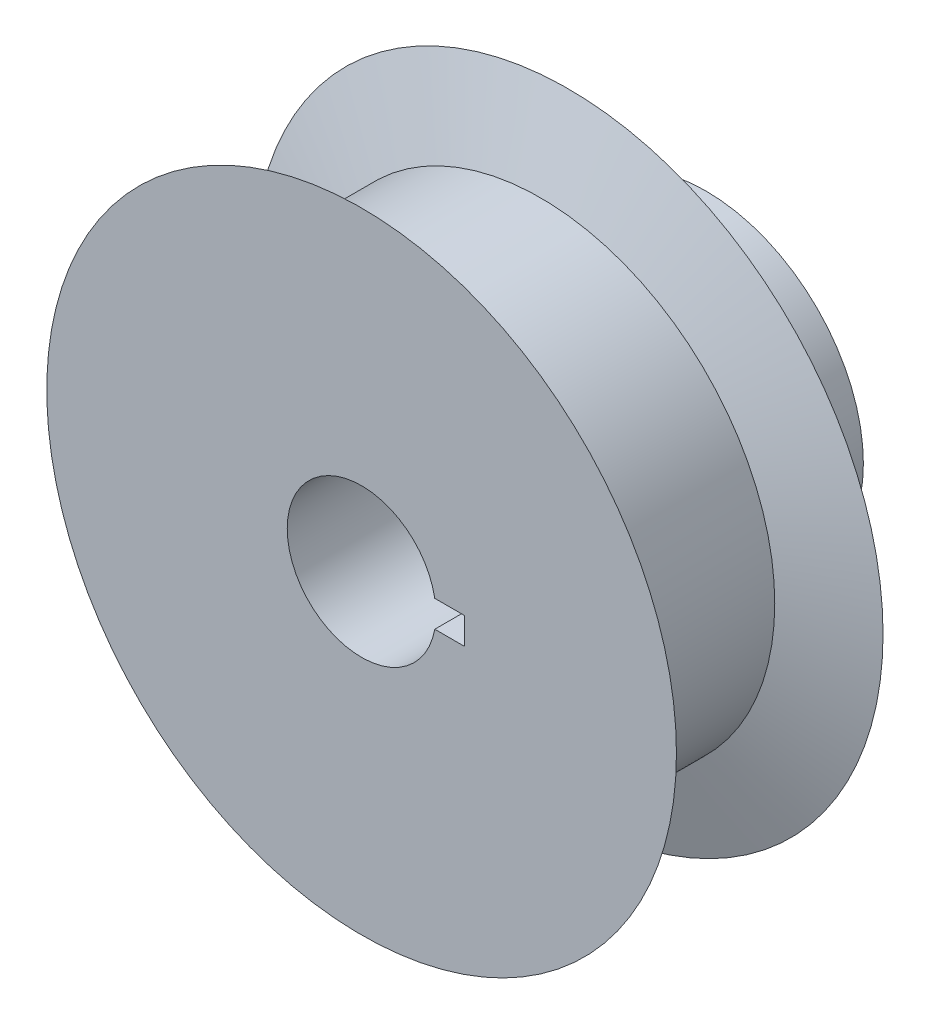
ISO-10303-21;
HEADER;
FILE_DESCRIPTION(('STEP AP214'),'2;1');
FILE_NAME('part.step','',(''),(''),'','','');
FILE_SCHEMA(('AUTOMOTIVE_DESIGN { 1 0 10303 214 1 1 1 1 }'));
ENDSEC;
DATA;
#1=APPLICATION_CONTEXT('core data for automotive mechanical design processes');
#2=APPLICATION_PROTOCOL_DEFINITION('international standard','automotive_design',2000,#1);
#3=PRODUCT_CONTEXT('',#1,'mechanical');
#4=PRODUCT('Part','Part','',(#3));
#5=PRODUCT_RELATED_PRODUCT_CATEGORY('part','',(#4));
#6=PRODUCT_DEFINITION_FORMATION('','',#4);
#7=PRODUCT_DEFINITION_CONTEXT('part definition',#1,'design');
#8=PRODUCT_DEFINITION('design','',#6,#7);
#9=PRODUCT_DEFINITION_SHAPE('','',#8);
#10=(LENGTH_UNIT() NAMED_UNIT(*) SI_UNIT(.MILLI.,.METRE.));
#11=(NAMED_UNIT(*) PLANE_ANGLE_UNIT() SI_UNIT($,.RADIAN.));
#12=(NAMED_UNIT(*) SI_UNIT($,.STERADIAN.) SOLID_ANGLE_UNIT());
#13=UNCERTAINTY_MEASURE_WITH_UNIT(LENGTH_MEASURE(1.E-05),#10,'distance_accuracy_value','');
#14=(GEOMETRIC_REPRESENTATION_CONTEXT(3) GLOBAL_UNCERTAINTY_ASSIGNED_CONTEXT((#13)) GLOBAL_UNIT_ASSIGNED_CONTEXT((#10,
#11,#12)) REPRESENTATION_CONTEXT('',''));
#15=CARTESIAN_POINT('',(0.,0.,0.));
#16=DIRECTION('',(0.,0.,1.));
#17=DIRECTION('',(1.,0.,0.));
#18=AXIS2_PLACEMENT_3D('',#15,#16,#17);
#19=CARTESIAN_POINT('',(0.,0.,-11.1125));
#20=DIRECTION('',(0.,0.,1.));
#21=DIRECTION('',(1.,0.,0.));
#22=AXIS2_PLACEMENT_3D('',#19,#20,#21);
#23=CYLINDRICAL_SURFACE('',#22,12.7);
#24=CARTESIAN_POINT('',(0.,0.,-11.1125));
#25=DIRECTION('',(0.,0.,-1.));
#26=DIRECTION('',(-1.,0.,0.));
#27=AXIS2_PLACEMENT_3D('',#24,#25,#26);
#28=CIRCLE('',#27,12.7);
#29=CARTESIAN_POINT('',(-12.7,0.,-11.1125));
#30=VERTEX_POINT('',#29);
#31=EDGE_CURVE('E46',#30,#30,#28,.T.);
#32=ORIENTED_EDGE('',*,*,#31,.F.);
#33=EDGE_LOOP('',(#32));
#34=FACE_BOUND('',#33,.T.);
#35=CARTESIAN_POINT('',(0.,0.,0.));
#36=DIRECTION('',(0.,0.,1.));
#37=DIRECTION('',(1.,0.,0.));
#38=AXIS2_PLACEMENT_3D('',#35,#36,#37);
#39=CIRCLE('',#38,12.7);
#40=CARTESIAN_POINT('',(12.7,0.,0.));
#41=VERTEX_POINT('',#40);
#42=EDGE_CURVE('E11',#41,#41,#39,.F.);
#43=ORIENTED_EDGE('',*,*,#42,.T.);
#44=EDGE_LOOP('',(#43));
#45=FACE_BOUND('',#44,.T.);
#46=CARTESIAN_POINT('',(0.599890423792715,-12.6858240362793,-8.82142));
#47=CARTESIAN_POINT('',(0.781499915618334,-12.6772325661334,-8.821414559961));
#48=CARTESIAN_POINT('',(0.962983905724362,-12.6647058853353,-8.80621038397143));
#49=CARTESIAN_POINT('',(1.3203597935846,-12.6324548574158,-8.74607005273274));
#50=CARTESIAN_POINT('',(1.49624791259333,-12.6127257543198,-8.70111423560601));
#51=CARTESIAN_POINT('',(1.8372428366672,-12.5675808253428,-8.58316031772912));
#52=CARTESIAN_POINT('',(2.00236601536051,-12.5421739091111,-8.51020602502936));
#53=CARTESIAN_POINT('',(2.31790452288061,-12.4877134753631,-8.33848176077857));
#54=CARTESIAN_POINT('',(2.46831926664194,-12.458659812893,-8.23971076287584));
#55=CARTESIAN_POINT('',(2.75418593482141,-12.3986419822888,-8.01632914503875));
#56=CARTESIAN_POINT('',(2.8891910790202,-12.3676486729577,-7.89115428364959));
#57=CARTESIAN_POINT('',(3.13646201368765,-12.3072678379319,-7.61969393720618));
#58=CARTESIAN_POINT('',(3.24872509430695,-12.2778805039027,-7.47340593995097));
#59=CARTESIAN_POINT('',(3.44845955901979,-12.2232974233163,-7.16168067319548));
#60=CARTESIAN_POINT('',(3.53564228636154,-12.1981517597457,-6.99604908252736));
#61=CARTESIAN_POINT('',(3.68065673550874,-12.1551853518605,-6.6515157272737));
#62=CARTESIAN_POINT('',(3.73849668607564,-12.1373625542197,-6.47261769921876));
#63=CARTESIAN_POINT('',(3.82124837634827,-12.1115602196657,-6.11315997859999));
#64=CARTESIAN_POINT('',(3.84722108108681,-12.1032641536063,-5.93286754868075));
#65=CARTESIAN_POINT('',(3.86881048150892,-12.0963816478951,-5.57030833808095));
#66=CARTESIAN_POINT('',(3.86443408628312,-12.0977929983115,-5.38804201619754));
#67=CARTESIAN_POINT('',(3.82618912587903,-12.1099395911969,-5.03332956055399));
#68=CARTESIAN_POINT('',(3.79333820049087,-12.12035307611,-4.86076111093762));
#69=CARTESIAN_POINT('',(3.70067128518278,-12.1489654534983,-4.52371288539244));
#70=CARTESIAN_POINT('',(3.64085282304655,-12.167165059749,-4.35923385258471));
#71=CARTESIAN_POINT('',(3.49505079595303,-12.2098503421476,-4.04017981961719));
#72=CARTESIAN_POINT('',(3.40868688849079,-12.2344265265299,-3.88579119514233));
#73=CARTESIAN_POINT('',(3.2125853539112,-12.2873750770946,-3.59337148245946));
#74=CARTESIAN_POINT('',(3.10284223127395,-12.3157483352333,-3.45534425205527));
#75=CARTESIAN_POINT('',(2.85762242470447,-12.3749966100948,-3.19336412870629));
#76=CARTESIAN_POINT('',(2.72124717222365,-12.4059267184544,-3.07026361921543));
#77=CARTESIAN_POINT('',(2.42958851879229,-12.4663247212654,-2.84849516580125));
#78=CARTESIAN_POINT('',(2.27430308200096,-12.4957924577985,-2.74982985600819));
#79=CARTESIAN_POINT('',(1.94656942883071,-12.5510484449517,-2.57857175372722));
#80=CARTESIAN_POINT('',(1.77391712430892,-12.5767814132278,-2.5063504550767));
#81=CARTESIAN_POINT('',(1.4180572792777,-12.6218554433664,-2.39231297306028));
#82=CARTESIAN_POINT('',(1.23485191917157,-12.6411978200877,-2.35049053302718));
#83=CARTESIAN_POINT('',(0.868526667234643,-12.6715623132124,-2.29958919221786));
#84=CARTESIAN_POINT('',(0.68554752746456,-12.682801885129,-2.28962772019902));
#85=CARTESIAN_POINT('',(0.320199212268037,-12.6972783649422,-2.30049667813913));
#86=CARTESIAN_POINT('',(0.137829946292931,-12.7005165187703,-2.32132231331176));
#87=CARTESIAN_POINT('',(-0.216241931832223,-12.6993628203996,-2.39227903048679));
#88=CARTESIAN_POINT('',(-0.388097807147044,-12.6951626148262,-2.44165258832991));
#89=CARTESIAN_POINT('',(-0.721230675093228,-12.680601222491,-2.56763709386153));
#90=CARTESIAN_POINT('',(-0.88250708949256,-12.6702396992865,-2.64424952885395));
#91=CARTESIAN_POINT('',(-1.19158784802362,-12.6449362385456,-2.82332086694122));
#92=CARTESIAN_POINT('',(-1.33925487159851,-12.6299531110891,-2.92601066728536));
#93=CARTESIAN_POINT('',(-1.61561953097636,-12.5975857558523,-3.15405042557506));
#94=CARTESIAN_POINT('',(-1.74431425345544,-12.5802011601027,-3.27940385710684));
#95=CARTESIAN_POINT('',(-1.98227728340032,-12.5449361578294,-3.55275786773037));
#96=CARTESIAN_POINT('',(-2.09100245751892,-12.5270539022117,-3.70123157231208));
#97=CARTESIAN_POINT('',(-2.28209788904067,-12.4936573862321,-4.01451908490168));
#98=CARTESIAN_POINT('',(-2.36446808375056,-12.4781431315033,-4.17933293177829));
#99=CARTESIAN_POINT('',(-2.5005401988816,-12.4515920159796,-4.5210630557227));
#100=CARTESIAN_POINT('',(-2.55419666590558,-12.44056226067,-4.69799802392935));
#101=CARTESIAN_POINT('',(-2.63091956330617,-12.4245653215815,-5.05863770560876));
#102=CARTESIAN_POINT('',(-2.65399070207697,-12.4195972046658,-5.24234137261218));
#103=CARTESIAN_POINT('',(-2.66863407895253,-12.4164585536595,-5.60734752730222));
#104=CARTESIAN_POINT('',(-2.66083003353647,-12.4181534148444,-5.78862407531853));
#105=CARTESIAN_POINT('',(-2.61537996794529,-12.4278041662189,-6.14721758332917));
#106=CARTESIAN_POINT('',(-2.57773428847538,-12.4357599849264,-6.32453458850627));
#107=CARTESIAN_POINT('',(-2.4740355686948,-12.4568015874471,-6.66941127904578));
#108=CARTESIAN_POINT('',(-2.40811526694805,-12.469863375599,-6.83701245406624));
#109=CARTESIAN_POINT('',(-2.24981673089795,-12.4993911092568,-7.15889079544913));
#110=CARTESIAN_POINT('',(-2.15743548417623,-12.51585744229,-7.31316644217663));
#111=CARTESIAN_POINT('',(-1.94671638176032,-12.5503736332648,-7.60719645417165));
#112=CARTESIAN_POINT('',(-1.82791525104076,-12.5684477807142,-7.74661608377171));
#113=CARTESIAN_POINT('',(-1.5685901361698,-12.6034363589931,-8.00375839048472));
#114=CARTESIAN_POINT('',(-1.42806234162893,-12.6203505856449,-8.12147725379554));
#115=CARTESIAN_POINT('',(-1.12770258578257,-12.6507409407537,-8.33285590361497));
#116=CARTESIAN_POINT('',(-0.967710129606117,-12.6641851706352,-8.42629252153702));
#117=CARTESIAN_POINT('',(-0.633983761456787,-12.6852640708827,-8.58484043855997));
#118=CARTESIAN_POINT('',(-0.460260198291297,-12.6929030712774,-8.64997283377505));
#119=CARTESIAN_POINT('',(-0.138894272977151,-12.7000523707523,-8.74019925556416));
#120=CARTESIAN_POINT('',(0.00724884055228734,-12.7008547214661,-8.77061678293768));
#121=CARTESIAN_POINT('',(0.302252935425036,-12.6972595520596,-8.81122892118289));
#122=CARTESIAN_POINT('',(0.451113792207188,-12.6928622696658,-8.82142445654393));
#123=CARTESIAN_POINT('',(0.599890423792715,-12.6858240362793,-8.82142));
#124=B_SPLINE_CURVE_WITH_KNOTS('',3,(#46,#47,#48,#49,#50,#51,#52,#53,#54,#55,#56,#57,#58,#59,
#60,#61,#62,#63,#64,#65,#66,#67,#68,#69,#70,#71,#72,#73,#74,#75,#76,#77,#78,#79,#80,#81,#82,#83,
#84,#85,#86,#87,#88,#89,#90,#91,#92,#93,#94,#95,#96,#97,#98,#99,#100,#101,#102,#103,#104,#105,
#106,#107,#108,#109,#110,#111,#112,#113,#114,#115,#116,#117,#118,#119,#120,#121,#122,#123),
.UNSPECIFIED.,.T.,.F.,(4,2,2,2,2,2,2,2,2,2,2,2,2,2,2,2,2,2,2,2,2,2,2,2,2,2,2,2,2,2,2,2,2,2,2,2,
2,2,4),(0.,0.544884526702368,1.09012950967437,1.63452482590377,2.17894178804279,
2.73645011780765,3.29402483891422,3.85778122046588,4.42137941709938,4.96565445608014,
5.50980559279984,6.03527573241726,6.56079405367239,7.09422372792981,7.62777892882716,
8.18411168750397,8.74050439313071,9.30443807858892,9.86825566280428,10.4163134122698,
10.9642858161729,11.4983445948033,12.0324325387228,12.5714252234892,13.1105005881733,
13.6625720767992,14.2146448786836,14.7675890375512,15.3204480647019,15.8621962611779,
16.4039382725444,16.9431643796467,17.4824518987919,18.0320688005284,18.5817822028163,
19.13638213317,19.6905679891061,20.136964210064,20.5833400226438),.UNSPECIFIED.);
#125=CARTESIAN_POINT('',(0.599890423792715,-12.6858240362793,-8.82142));
#126=VERTEX_POINT('',#125);
#127=EDGE_CURVE('E103',#126,#126,#124,.T.);
#128=ORIENTED_EDGE('',*,*,#127,.F.);
#129=EDGE_LOOP('',(#128));
#130=FACE_BOUND('',#129,.T.);
#131=ADVANCED_FACE('F33',(#34,#45,#130),#23,.T.);
#132=CARTESIAN_POINT('',(0.,0.,16.66748));
#133=DIRECTION('',(0.,0.,-1.));
#134=DIRECTION('',(-1.,0.,0.));
#135=AXIS2_PLACEMENT_3D('',#132,#133,#134);
#136=CYLINDRICAL_SURFACE('',#135,6.);
#137=CARTESIAN_POINT('',(0.,0.,-11.1125));
#138=DIRECTION('',(0.,0.,-1.));
#139=DIRECTION('',(-1.,0.,0.));
#140=AXIS2_PLACEMENT_3D('',#137,#138,#139);
#141=CIRCLE('',#140,6.);
#142=CARTESIAN_POINT('',(5.90226338505419,-1.07855780255333,-11.1125));
#143=VERTEX_POINT('',#142);
#144=CARTESIAN_POINT('',(5.90226338505419,1.07855780255334,-11.1125));
#145=VERTEX_POINT('',#144);
#146=EDGE_CURVE('E100',#143,#145,#141,.T.);
#147=ORIENTED_EDGE('',*,*,#146,.T.);
#148=DIRECTION('',(0.,0.,-1.));
#149=VECTOR('',#148,1.);
#150=CARTESIAN_POINT('',(5.90226338505419,1.07855780255334,16.66748));
#151=LINE('',#150,#149);
#152=CARTESIAN_POINT('',(5.90226338505419,1.07855780255334,16.66748));
#153=VERTEX_POINT('',#152);
#154=EDGE_CURVE('E118',#153,#145,#151,.T.);
#155=ORIENTED_EDGE('',*,*,#154,.F.);
#156=CARTESIAN_POINT('',(0.,0.,16.66748));
#157=DIRECTION('',(0.,0.,-1.));
#158=DIRECTION('',(-1.,0.,0.));
#159=AXIS2_PLACEMENT_3D('',#156,#157,#158);
#160=CIRCLE('',#159,6.);
#161=CARTESIAN_POINT('',(5.90226338505419,-1.07855780255334,16.66748));
#162=VERTEX_POINT('',#161);
#163=EDGE_CURVE('E53',#162,#153,#160,.T.);
#164=ORIENTED_EDGE('',*,*,#163,.F.);
#165=DIRECTION('',(0.,0.,-1.));
#166=VECTOR('',#165,1.);
#167=CARTESIAN_POINT('',(5.90226338505419,-1.07855780255333,16.66748));
#168=LINE('',#167,#166);
#169=EDGE_CURVE('E86',#162,#143,#168,.T.);
#170=ORIENTED_EDGE('',*,*,#169,.T.);
#171=EDGE_LOOP('',(#147,#155,#164,#170));
#172=FACE_BOUND('',#171,.T.);
#173=CARTESIAN_POINT('',(0.599890423792715,-5.96993563444714,-8.82142));
#174=CARTESIAN_POINT('',(0.517188567065031,-5.97824535937641,-8.8214193367522));
#175=CARTESIAN_POINT('',(0.434292466891896,-5.98483554052565,-8.8182721075559));
#176=CARTESIAN_POINT('',(0.268746068061959,-5.99455245827511,-8.8056402925649));
#177=CARTESIAN_POINT('',(0.186095930958278,-5.99767727475262,-8.79615219802353));
#178=CARTESIAN_POINT('',(0.0215623835931082,-6.00052584233722,-8.77085383742436));
#179=CARTESIAN_POINT('',(-0.0603195285123498,-6.00024394680347,-8.75503311697692));
#180=CARTESIAN_POINT('',(-0.222571835948983,-5.99642111021913,-8.71719619613604));
#181=CARTESIAN_POINT('',(-0.302941611205134,-5.99287886070412,-8.69517751080189));
#182=CARTESIAN_POINT('',(-0.540329290858641,-5.97771072316467,-8.62025396940035));
#183=CARTESIAN_POINT('',(-0.69433851158346,-5.9615522458911,-8.55837081703124));
#184=CARTESIAN_POINT('',(-0.990021720076639,-5.91964847555008,-8.41276882811694));
#185=CARTESIAN_POINT('',(-1.1316976129027,-5.89390466632671,-8.32905337189203));
#186=CARTESIAN_POINT('',(-1.40608553301741,-5.83467981578842,-8.13788736583231));
#187=CARTESIAN_POINT('',(-1.53810612535292,-5.80090243904,-8.02953739022671));
#188=CARTESIAN_POINT('',(-1.78333414714238,-5.7302741949364,-7.79408333655747));
#189=CARTESIAN_POINT('',(-1.89652924171249,-5.69342133601703,-7.66696706454681));
#190=CARTESIAN_POINT('',(-2.1113419649884,-5.61750555464239,-7.38415905181232));
#191=CARTESIAN_POINT('',(-2.21096550354705,-5.57854713846015,-7.22691905840363));
#192=CARTESIAN_POINT('',(-2.38255239518661,-5.50746176050839,-6.89641988188501));
#193=CARTESIAN_POINT('',(-2.45452159918646,-5.47533335433445,-6.72316409692291));
#194=CARTESIAN_POINT('',(-2.53914135272538,-5.4363296345809,-6.45644478177275));
#195=CARTESIAN_POINT('',(-2.56335147113455,-5.42491781662196,-6.36716934572491));
#196=CARTESIAN_POINT('',(-2.6041567949792,-5.40544959715944,-6.18655136800217));
#197=CARTESIAN_POINT('',(-2.62075562149105,-5.39739160024243,-6.09520983102541));
#198=CARTESIAN_POINT('',(-2.64611347912019,-5.38500562272272,-5.91123989044395));
#199=CARTESIAN_POINT('',(-2.6548766480278,-5.38067567348777,-5.81861219230098));
#200=CARTESIAN_POINT('',(-2.66446633521801,-5.37593114431687,-5.63287589576075));
#201=CARTESIAN_POINT('',(-2.66529355140702,-5.37551622008442,-5.53976734037178));
#202=CARTESIAN_POINT('',(-2.65642301044261,-5.37992046683034,-5.27899946243105));
#203=CARTESIAN_POINT('',(-2.63772378483922,-5.38921838573536,-5.11161776947799));
#204=CARTESIAN_POINT('',(-2.57516181366523,-5.41938114003802,-4.78281503429172));
#205=CARTESIAN_POINT('',(-2.53129267316566,-5.4402489149476,-4.6213955179685));
#206=CARTESIAN_POINT('',(-2.419729599324,-5.49077932125476,-4.30737028240446));
#207=CARTESIAN_POINT('',(-2.35188903178884,-5.52049590109273,-4.15482569569528));
#208=CARTESIAN_POINT('',(-2.19437906065333,-5.58497331089461,-3.86261935871359));
#209=CARTESIAN_POINT('',(-2.10470020956803,-5.61973632136487,-3.72296322028268));
#210=CARTESIAN_POINT('',(-1.89551213449476,-5.69390178086216,-3.44587475740554));
#211=CARTESIAN_POINT('',(-1.7739269546649,-5.73342250673631,-3.3100355525168));
#212=CARTESIAN_POINT('',(-1.50919852827073,-5.80872144774769,-3.05993082605811));
#213=CARTESIAN_POINT('',(-1.36604940360156,-5.84449863791631,-2.9456712060551));
#214=CARTESIAN_POINT('',(-1.05802401654371,-5.90811287016646,-2.7398322803931));
#215=CARTESIAN_POINT('',(-0.892753485432463,-5.93576671321788,-2.6487816234324));
#216=CARTESIAN_POINT('',(-0.547557714355909,-5.97748237576239,-2.49615896769573));
#217=CARTESIAN_POINT('',(-0.367645610383,-5.99155623617896,-2.43456087879416));
#218=CARTESIAN_POINT('',(-0.0160209937258541,-6.00232020953374,-2.34761586758588));
#219=CARTESIAN_POINT('',(0.154962609092308,-6.00046672768334,-2.3194953506414));
#220=CARTESIAN_POINT('',(0.49838284228537,-5.98173422815968,-2.29065562545005));
#221=CARTESIAN_POINT('',(0.670819018228775,-5.96485974858726,-2.28992814417178));
#222=CARTESIAN_POINT('',(1.00132127830687,-5.91807115305853,-2.31441682057784));
#223=CARTESIAN_POINT('',(1.1596285272518,-5.88900080715257,-2.3380778740155));
#224=CARTESIAN_POINT('',(1.46873572649464,-5.81961573610381,-2.40739995119003));
#225=CARTESIAN_POINT('',(1.61953440443176,-5.77929911281973,-2.45306468964548));
#226=CARTESIAN_POINT('',(1.91939862168803,-5.68700095979349,-2.56766414211319));
#227=CARTESIAN_POINT('',(2.06782003989894,-5.63446562147251,-2.63782819765501));
#228=CARTESIAN_POINT('',(2.35062869557352,-5.52247440818452,-2.79809656208447));
#229=CARTESIAN_POINT('',(2.48500663175966,-5.4630140010343,-2.88821396480293));
#230=CARTESIAN_POINT('',(2.75543126588085,-5.33227085079247,-3.09986297483871));
#231=CARTESIAN_POINT('',(2.88919287537042,-5.26048339044572,-3.22400529574516));
#232=CARTESIAN_POINT('',(3.13461153085831,-5.11804157601892,-3.49319778630338));
#233=CARTESIAN_POINT('',(3.24625926918708,-5.04738771051527,-3.63825671550024));
#234=CARTESIAN_POINT('',(3.43451342899638,-4.92093381601734,-3.93118314336683));
#235=CARTESIAN_POINT('',(3.5135783753732,-4.86435313309271,-4.07712711929554));
#236=CARTESIAN_POINT('',(3.64962287878785,-4.76313603722934,-4.38276877809673));
#237=CARTESIAN_POINT('',(3.70663884389103,-4.71847997200752,-4.54244325101573));
#238=CARTESIAN_POINT('',(3.78822009497184,-4.65313521156778,-4.84488578711542));
#239=CARTESIAN_POINT('',(3.81661938742818,-4.62968609715809,-4.98601081071865));
#240=CARTESIAN_POINT('',(3.85451547227756,-4.59818960148855,-5.27243700333557));
#241=CARTESIAN_POINT('',(3.86402919560087,-4.590128425177,-5.41773431321035));
#242=CARTESIAN_POINT('',(3.86354215159469,-4.59053827571288,-5.7084445157945));
#243=CARTESIAN_POINT('',(3.8535176481431,-4.59902941122925,-5.85385733429992));
#244=CARTESIAN_POINT('',(3.81458188225231,-4.63136871374297,-6.14040181505185));
#245=CARTESIAN_POINT('',(3.78565579658015,-4.65522893346441,-6.28153002619402));
#246=CARTESIAN_POINT('',(3.71046166426796,-4.71537525927461,-6.55639075701809));
#247=CARTESIAN_POINT('',(3.66417148108146,-4.75167722154446,-6.69011358517651));
#248=CARTESIAN_POINT('',(3.55602817006731,-4.83313978367942,-6.94816447127165));
#249=CARTESIAN_POINT('',(3.49416949385806,-4.87830354049031,-7.07248915926531));
#250=CARTESIAN_POINT('',(3.34231322531069,-4.98388624784201,-7.33505031165582));
#251=CARTESIAN_POINT('',(3.24915028618663,-5.04553846194759,-7.47095948097066));
#252=CARTESIAN_POINT('',(3.04427595005254,-5.17174034965515,-7.72659807140005));
#253=CARTESIAN_POINT('',(2.93254498443904,-5.23629302708829,-7.84631017858066));
#254=CARTESIAN_POINT('',(2.67013481220038,-5.37551995042824,-8.08822412738664));
#255=CARTESIAN_POINT('',(2.51606649056561,-5.44991052356016,-8.20695205135772));
#256=CARTESIAN_POINT('',(2.18650866438381,-5.59027910181928,-8.41650014381068));
#257=CARTESIAN_POINT('',(2.01102629262206,-5.65625989326223,-8.50732956971445));
#258=CARTESIAN_POINT('',(1.67411610460453,-5.76393517343034,-8.6439633593166));
#259=CARTESIAN_POINT('',(1.51547709346123,-5.80785542820408,-8.69482930089055));
#260=CARTESIAN_POINT('',(1.2713409964001,-5.86435810029413,-8.75270365351114));
#261=CARTESIAN_POINT('',(1.18901236963472,-5.88161763013508,-8.76891778099868));
#262=CARTESIAN_POINT('',(1.02274823384459,-5.91279270088121,-8.79500350414572));
#263=CARTESIAN_POINT('',(0.938813675895396,-5.926710158675,-8.80487874102242));
#264=CARTESIAN_POINT('',(0.81217765682956,-5.94492989497271,-8.81478470123907));
#265=CARTESIAN_POINT('',(0.769841143350834,-5.95056061461557,-8.81726887364567));
#266=CARTESIAN_POINT('',(0.684983745068645,-5.96092478998312,-8.82058688163287));
#267=CARTESIAN_POINT('',(0.642462820490539,-5.9656580411725,-8.82142034141976));
#268=CARTESIAN_POINT('',(0.599890423792715,-5.96993563444714,-8.82142));
#269=B_SPLINE_CURVE_WITH_KNOTS('',3,(#173,#174,#175,#176,#177,#178,#179,#180,#181,#182,#183,
#184,#185,#186,#187,#188,#189,#190,#191,#192,#193,#194,#195,#196,#197,#198,#199,#200,#201,#202,
#203,#204,#205,#206,#207,#208,#209,#210,#211,#212,#213,#214,#215,#216,#217,#218,#219,#220,#221,
#222,#223,#224,#225,#226,#227,#228,#229,#230,#231,#232,#233,#234,#235,#236,#237,#238,#239,#240,
#241,#242,#243,#244,#245,#246,#247,#248,#249,#250,#251,#252,#253,#254,#255,#256,#257,#258,#259,
#260,#261,#262,#263,#264,#265,#266,#267,#268),.UNSPECIFIED.,.T.,.F.,(4,2,2,2,2,2,2,2,2,2,2,2,2,
2,2,2,2,2,2,2,2,2,2,2,2,2,2,2,2,2,2,2,2,2,2,2,2,2,2,2,2,2,2,2,2,2,2,4),(0.,0.249312494007734,
0.498763060574063,0.748627149231644,0.99859155855711,1.49638361659998,1.99409864664728,
2.51423759942922,3.03471602743695,3.60260928292767,4.17038232112262,4.44965894831239,
4.72880257128602,5.00779869916068,5.28677029123249,5.79014479460623,6.29364724718376,
6.80028453924659,7.30714139884222,7.86424816306654,8.42150706446638,8.99050841414128,
9.55900478418075,10.0761118300404,10.5930627020023,11.078974432308,11.5649682242359,
12.0800543574044,12.5954795086668,13.1813941708698,13.7675549213801,14.2916537149107,
14.8148833644424,15.2505436533512,15.6858131956994,16.1216118572503,16.5577526970632,
16.9944514493313,17.4313060555318,17.9571768798284,18.4836054686682,19.1053520528119,
19.7268921023931,20.2413299697301,20.4980703593581,20.7546631386,20.8829724093664,
21.0113108870812),.UNSPECIFIED.);
#270=CARTESIAN_POINT('',(0.599890423792715,-5.96993563444714,-8.82142));
#271=VERTEX_POINT('',#270);
#272=EDGE_CURVE('E37',#271,#271,#269,.T.);
#273=ORIENTED_EDGE('',*,*,#272,.F.);
#274=EDGE_LOOP('',(#273));
#275=FACE_BOUND('',#274,.T.);
#276=ADVANCED_FACE('F128',(#172,#275),#136,.F.);
#277=CARTESIAN_POINT('',(0.,0.,16.66748));
#278=DIRECTION('',(0.,0.,1.));
#279=DIRECTION('',(1.,0.,0.));
#280=AXIS2_PLACEMENT_3D('',#277,#278,#279);
#281=PLANE('',#280);
#282=DIRECTION('',(0.,-1.,0.));
#283=VECTOR('',#282,1.);
#284=CARTESIAN_POINT('',(8.31526338505419,-1.07855780255334,16.66748));
#285=LINE('',#284,#283);
#286=CARTESIAN_POINT('',(8.31526338505419,1.07855780255334,16.66748));
#287=VERTEX_POINT('',#286);
#288=CARTESIAN_POINT('',(8.31526338505419,-1.07855780255334,16.66748));
#289=VERTEX_POINT('',#288);
#290=EDGE_CURVE('E81',#287,#289,#285,.T.);
#291=ORIENTED_EDGE('',*,*,#290,.T.);
#292=DIRECTION('',(-1.,0.,0.));
#293=VECTOR('',#292,1.);
#294=CARTESIAN_POINT('',(5.90226338505419,-1.07855780255334,16.66748));
#295=LINE('',#294,#293);
#296=EDGE_CURVE('E90',#289,#162,#295,.T.);
#297=ORIENTED_EDGE('',*,*,#296,.T.);
#298=ORIENTED_EDGE('',*,*,#163,.T.);
#299=DIRECTION('',(1.,0.,0.));
#300=VECTOR('',#299,1.);
#301=CARTESIAN_POINT('',(5.90226338505419,1.07855780255334,16.66748));
#302=LINE('',#301,#300);
#303=EDGE_CURVE('E87',#153,#287,#302,.T.);
#304=ORIENTED_EDGE('',*,*,#303,.T.);
#305=EDGE_LOOP('',(#291,#297,#298,#304));
#306=FACE_BOUND('',#305,.T.);
#307=CARTESIAN_POINT('',(0.,0.,16.66748));
#308=DIRECTION('',(0.,0.,1.));
#309=DIRECTION('',(1.,0.,0.));
#310=AXIS2_PLACEMENT_3D('',#307,#308,#309);
#311=CIRCLE('',#310,25.4);
#312=CARTESIAN_POINT('',(25.4,0.,16.66748));
#313=VERTEX_POINT('',#312);
#314=EDGE_CURVE('E148',#313,#313,#311,.T.);
#315=ORIENTED_EDGE('',*,*,#314,.T.);
#316=EDGE_LOOP('',(#315));
#317=FACE_BOUND('',#316,.T.);
#318=ADVANCED_FACE('F94',(#306,#317),#281,.T.);
#319=CARTESIAN_POINT('',(0.,0.,0.));
#320=DIRECTION('',(0.,0.,1.));
#321=DIRECTION('',(1.,0.,0.));
#322=AXIS2_PLACEMENT_3D('',#319,#320,#321);
#323=PLANE('',#322);
#324=ORIENTED_EDGE('',*,*,#42,.F.);
#325=EDGE_LOOP('',(#324));
#326=FACE_BOUND('',#325,.T.);
#327=CARTESIAN_POINT('',(0.,0.,0.));
#328=DIRECTION('',(0.,0.,1.));
#329=DIRECTION('',(1.,0.,0.));
#330=AXIS2_PLACEMENT_3D('',#327,#328,#329);
#331=CIRCLE('',#330,25.4);
#332=CARTESIAN_POINT('',(25.4,0.,0.));
#333=VERTEX_POINT('',#332);
#334=EDGE_CURVE('E143',#333,#333,#331,.T.);
#335=ORIENTED_EDGE('',*,*,#334,.F.);
#336=EDGE_LOOP('',(#335));
#337=FACE_BOUND('',#336,.T.);
#338=ADVANCED_FACE('F35',(#326,#337),#323,.F.);
#339=CARTESIAN_POINT('',(0.,0.,-11.1125));
#340=DIRECTION('',(0.,0.,-1.));
#341=DIRECTION('',(-1.,0.,0.));
#342=AXIS2_PLACEMENT_3D('',#339,#340,#341);
#343=PLANE('',#342);
#344=DIRECTION('',(0.,-1.,0.));
#345=VECTOR('',#344,1.);
#346=CARTESIAN_POINT('',(8.31526338505419,-1.07855780255334,-11.1125));
#347=LINE('',#346,#345);
#348=CARTESIAN_POINT('',(8.31526338505419,1.07855780255334,-11.1125));
#349=VERTEX_POINT('',#348);
#350=CARTESIAN_POINT('',(8.31526338505419,-1.07855780255334,-11.1125));
#351=VERTEX_POINT('',#350);
#352=EDGE_CURVE('E61',#349,#351,#347,.T.);
#353=ORIENTED_EDGE('',*,*,#352,.F.);
#354=DIRECTION('',(1.,0.,0.));
#355=VECTOR('',#354,1.);
#356=CARTESIAN_POINT('',(5.90226338505419,1.07855780255334,-11.1125));
#357=LINE('',#356,#355);
#358=EDGE_CURVE('E97',#145,#349,#357,.T.);
#359=ORIENTED_EDGE('',*,*,#358,.F.);
#360=ORIENTED_EDGE('',*,*,#146,.F.);
#361=DIRECTION('',(-1.,0.,0.));
#362=VECTOR('',#361,1.);
#363=CARTESIAN_POINT('',(5.90226338505419,-1.07855780255334,-11.1125));
#364=LINE('',#363,#362);
#365=EDGE_CURVE('E112',#351,#143,#364,.T.);
#366=ORIENTED_EDGE('',*,*,#365,.F.);
#367=EDGE_LOOP('',(#353,#359,#360,#366));
#368=FACE_BOUND('',#367,.T.);
#369=ORIENTED_EDGE('',*,*,#31,.T.);
#370=EDGE_LOOP('',(#369));
#371=FACE_BOUND('',#370,.T.);
#372=ADVANCED_FACE('F124',(#368,#371),#343,.T.);
#373=CARTESIAN_POINT('',(8.31526338505419,-1.07855780255334,16.66748));
#374=DIRECTION('',(1.,0.,0.));
#375=DIRECTION('',(0.,0.,-1.));
#376=AXIS2_PLACEMENT_3D('',#373,#374,#375);
#377=PLANE('',#376);
#378=ORIENTED_EDGE('',*,*,#352,.T.);
#379=DIRECTION('',(0.,0.,-1.));
#380=VECTOR('',#379,1.);
#381=CARTESIAN_POINT('',(8.31526338505419,-1.07855780255334,16.66748));
#382=LINE('',#381,#380);
#383=EDGE_CURVE('E77',#289,#351,#382,.T.);
#384=ORIENTED_EDGE('',*,*,#383,.F.);
#385=ORIENTED_EDGE('',*,*,#290,.F.);
#386=DIRECTION('',(0.,0.,-1.));
#387=VECTOR('',#386,1.);
#388=CARTESIAN_POINT('',(8.31526338505419,1.07855780255334,16.66748));
#389=LINE('',#388,#387);
#390=EDGE_CURVE('E116',#287,#349,#389,.T.);
#391=ORIENTED_EDGE('',*,*,#390,.T.);
#392=EDGE_LOOP('',(#378,#384,#385,#391));
#393=FACE_BOUND('',#392,.T.);
#394=ADVANCED_FACE('F79',(#393),#377,.F.);
#395=CARTESIAN_POINT('',(5.90226338505419,1.07855780255334,16.66748));
#396=DIRECTION('',(0.,1.,0.));
#397=DIRECTION('',(0.,0.,1.));
#398=AXIS2_PLACEMENT_3D('',#395,#396,#397);
#399=PLANE('',#398);
#400=ORIENTED_EDGE('',*,*,#358,.T.);
#401=ORIENTED_EDGE('',*,*,#390,.F.);
#402=ORIENTED_EDGE('',*,*,#303,.F.);
#403=ORIENTED_EDGE('',*,*,#154,.T.);
#404=EDGE_LOOP('',(#400,#401,#402,#403));
#405=FACE_BOUND('',#404,.T.);
#406=ADVANCED_FACE('F167',(#405),#399,.F.);
#407=CARTESIAN_POINT('',(5.90226338505419,-1.07855780255334,16.66748));
#408=DIRECTION('',(0.,-1.,0.));
#409=DIRECTION('',(1.,0.,0.));
#410=AXIS2_PLACEMENT_3D('',#407,#408,#409);
#411=PLANE('',#410);
#412=ORIENTED_EDGE('',*,*,#365,.T.);
#413=ORIENTED_EDGE('',*,*,#169,.F.);
#414=ORIENTED_EDGE('',*,*,#296,.F.);
#415=ORIENTED_EDGE('',*,*,#383,.T.);
#416=EDGE_LOOP('',(#412,#413,#414,#415));
#417=FACE_BOUND('',#416,.T.);
#418=ADVANCED_FACE('F91',(#417),#411,.F.);
#419=CARTESIAN_POINT('',(0.599890423792715,1.5875,-5.55752));
#420=DIRECTION('',(0.,-1.,0.));
#421=DIRECTION('',(0.,0.,-1.));
#422=AXIS2_PLACEMENT_3D('',#419,#420,#421);
#423=CYLINDRICAL_SURFACE('',#422,3.2639);
#424=ORIENTED_EDGE('',*,*,#272,.T.);
#425=EDGE_LOOP('',(#424));
#426=FACE_BOUND('',#425,.T.);
#427=ORIENTED_EDGE('',*,*,#127,.T.);
#428=EDGE_LOOP('',(#427));
#429=FACE_BOUND('',#428,.T.);
#430=ADVANCED_FACE('F155',(#426,#429),#423,.F.);
#431=CARTESIAN_POINT('',(0.,0.,16.66748));
#432=DIRECTION('',(0.,0.,1.));
#433=DIRECTION('',(1.,0.,0.));
#434=AXIS2_PLACEMENT_3D('',#431,#432,#433);
#435=CONICAL_SURFACE('',#434,25.4,1.23918376891597);
#436=CARTESIAN_POINT('',(0.,0.,14.42974));
#437=DIRECTION('',(0.,0.,1.));
#438=DIRECTION('',(1.,0.,0.));
#439=AXIS2_PLACEMENT_3D('',#436,#437,#438);
#440=CIRCLE('',#439,18.9011311505899);
#441=CARTESIAN_POINT('',(18.9011311505899,0.,14.42974));
#442=VERTEX_POINT('',#441);
#443=EDGE_CURVE('E135',#442,#442,#440,.T.);
#444=ORIENTED_EDGE('',*,*,#443,.T.);
#445=EDGE_LOOP('',(#444));
#446=FACE_BOUND('',#445,.T.);
#447=ORIENTED_EDGE('',*,*,#314,.F.);
#448=EDGE_LOOP('',(#447));
#449=FACE_BOUND('',#448,.T.);
#450=ADVANCED_FACE('F152',(#446,#449),#435,.T.);
#451=CARTESIAN_POINT('',(0.,0.,16.66748));
#452=DIRECTION('',(0.,0.,1.));
#453=DIRECTION('',(1.,0.,0.));
#454=AXIS2_PLACEMENT_3D('',#451,#452,#453);
#455=CYLINDRICAL_SURFACE('',#454,18.9011311505899);
#456=CARTESIAN_POINT('',(0.,0.,2.23774));
#457=DIRECTION('',(0.,0.,1.));
#458=DIRECTION('',(1.,0.,0.));
#459=AXIS2_PLACEMENT_3D('',#456,#457,#458);
#460=CIRCLE('',#459,18.9011311505899);
#461=CARTESIAN_POINT('',(18.9011311505899,0.,2.23774));
#462=VERTEX_POINT('',#461);
#463=EDGE_CURVE('E139',#462,#462,#460,.T.);
#464=ORIENTED_EDGE('',*,*,#463,.T.);
#465=EDGE_LOOP('',(#464));
#466=FACE_BOUND('',#465,.T.);
#467=ORIENTED_EDGE('',*,*,#443,.F.);
#468=EDGE_LOOP('',(#467));
#469=FACE_BOUND('',#468,.T.);
#470=ADVANCED_FACE('F154',(#466,#469),#455,.T.);
#471=CARTESIAN_POINT('',(0.,0.,0.));
#472=DIRECTION('',(0.,0.,-1.));
#473=DIRECTION('',(-1.,0.,0.));
#474=AXIS2_PLACEMENT_3D('',#471,#472,#473);
#475=CONICAL_SURFACE('',#474,25.4,1.23918376891597);
#476=ORIENTED_EDGE('',*,*,#463,.F.);
#477=EDGE_LOOP('',(#476));
#478=FACE_BOUND('',#477,.T.);
#479=ORIENTED_EDGE('',*,*,#334,.T.);
#480=EDGE_LOOP('',(#479));
#481=FACE_BOUND('',#480,.T.);
#482=ADVANCED_FACE('F161',(#478,#481),#475,.T.);
#483=CLOSED_SHELL('',(#131,#276,#318,#338,#372,#394,#406,#418,#430,#450,#470,#482));
#484=MANIFOLD_SOLID_BREP('B2',#483);
#485=ADVANCED_BREP_SHAPE_REPRESENTATION('',(#18,#484),#14);
#486=SHAPE_DEFINITION_REPRESENTATION(#9,#485);
ENDSEC;
END-ISO-10303-21;
